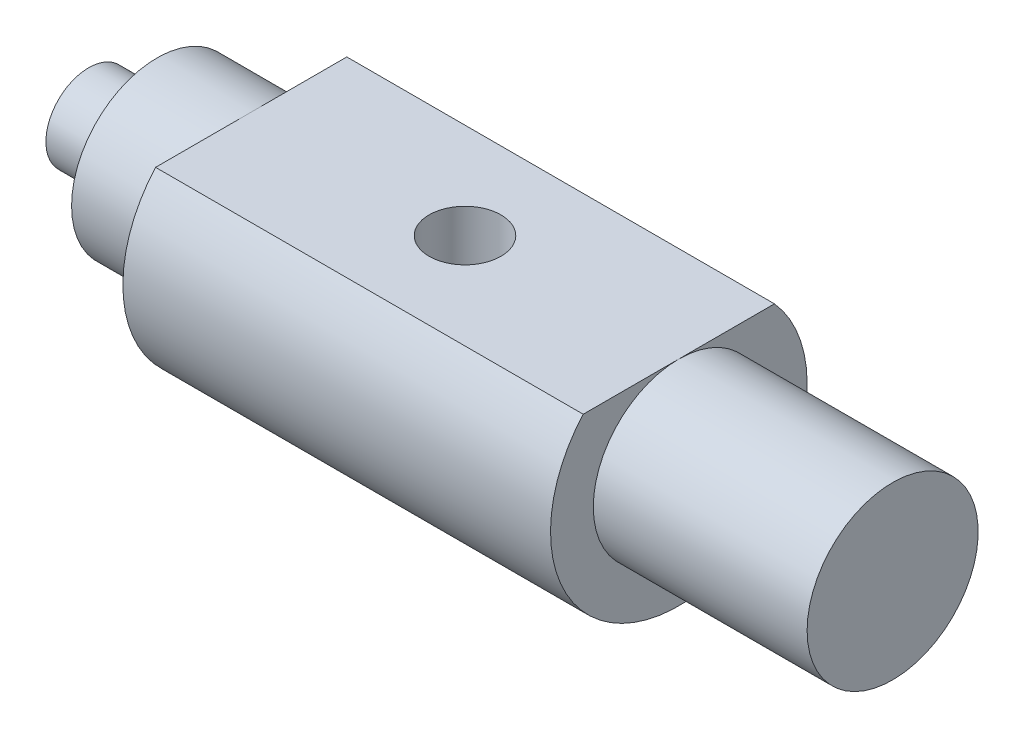
ISO-10303-21;
HEADER;
FILE_DESCRIPTION(('STEP AP214'),'2;1');
FILE_NAME('part.step','',(''),(''),'','','');
FILE_SCHEMA(('AUTOMOTIVE_DESIGN { 1 0 10303 214 1 1 1 1 }'));
ENDSEC;
DATA;
#1=APPLICATION_CONTEXT('core data for automotive mechanical design processes');
#2=APPLICATION_PROTOCOL_DEFINITION('international standard','automotive_design',2000,#1);
#3=PRODUCT_CONTEXT('',#1,'mechanical');
#4=PRODUCT('Part','Part','',(#3));
#5=PRODUCT_RELATED_PRODUCT_CATEGORY('part','',(#4));
#6=PRODUCT_DEFINITION_FORMATION('','',#4);
#7=PRODUCT_DEFINITION_CONTEXT('part definition',#1,'design');
#8=PRODUCT_DEFINITION('design','',#6,#7);
#9=PRODUCT_DEFINITION_SHAPE('','',#8);
#10=(LENGTH_UNIT() NAMED_UNIT(*) SI_UNIT(.MILLI.,.METRE.));
#11=(NAMED_UNIT(*) PLANE_ANGLE_UNIT() SI_UNIT($,.RADIAN.));
#12=(NAMED_UNIT(*) SI_UNIT($,.STERADIAN.) SOLID_ANGLE_UNIT());
#13=UNCERTAINTY_MEASURE_WITH_UNIT(LENGTH_MEASURE(1.E-05),#10,'distance_accuracy_value','');
#14=(GEOMETRIC_REPRESENTATION_CONTEXT(3) GLOBAL_UNCERTAINTY_ASSIGNED_CONTEXT((#13)) GLOBAL_UNIT_ASSIGNED_CONTEXT((#10,
#11,#12)) REPRESENTATION_CONTEXT('',''));
#15=CARTESIAN_POINT('',(0.,0.,0.));
#16=DIRECTION('',(0.,0.,1.));
#17=DIRECTION('',(1.,0.,0.));
#18=AXIS2_PLACEMENT_3D('',#15,#16,#17);
#19=CARTESIAN_POINT('',(-25.000012,0.,0.));
#20=DIRECTION('',(1.,0.,0.));
#21=DIRECTION('',(0.,0.,-1.));
#22=AXIS2_PLACEMENT_3D('',#19,#20,#21);
#23=CYLINDRICAL_SURFACE('',#22,2.5);
#24=CARTESIAN_POINT('',(-18.,0.,0.));
#25=DIRECTION('',(-1.,0.,0.));
#26=DIRECTION('',(0.,0.,1.));
#27=AXIS2_PLACEMENT_3D('',#24,#25,#26);
#28=CIRCLE('',#27,2.5);
#29=CARTESIAN_POINT('',(-18.,0.,-2.5));
#30=VERTEX_POINT('',#29);
#31=EDGE_CURVE('E94',#30,#30,#28,.T.);
#32=CARTESIAN_POINT('',(-22.,0.,0.));
#33=DIRECTION('',(-1.,0.,0.));
#34=DIRECTION('',(0.,0.,1.));
#35=AXIS2_PLACEMENT_3D('',#32,#33,#34);
#36=CIRCLE('',#35,2.5);
#37=CARTESIAN_POINT('',(-22.,0.,-2.5));
#38=VERTEX_POINT('',#37);
#39=EDGE_CURVE('E90',#38,#38,#36,.T.);
#40=CARTESIAN_POINT('',(-18.,0.,-2.5));
#41=CARTESIAN_POINT('',(-18.0416666666667,0.,-2.5));
#42=CARTESIAN_POINT('',(-18.0833333333333,0.,-2.5));
#43=CARTESIAN_POINT('',(-18.1666666666667,0.,-2.5));
#44=CARTESIAN_POINT('',(-18.2083333333333,0.,-2.5));
#45=CARTESIAN_POINT('',(-18.2916666666667,0.,-2.5));
#46=CARTESIAN_POINT('',(-18.3333333333333,0.,-2.5));
#47=CARTESIAN_POINT('',(-18.4166666666667,0.,-2.5));
#48=CARTESIAN_POINT('',(-18.4583333333333,0.,-2.5));
#49=CARTESIAN_POINT('',(-18.5416666666667,0.,-2.5));
#50=CARTESIAN_POINT('',(-18.5833333333333,0.,-2.5));
#51=CARTESIAN_POINT('',(-18.6666666666667,0.,-2.5));
#52=CARTESIAN_POINT('',(-18.7083333333333,0.,-2.5));
#53=CARTESIAN_POINT('',(-18.7916666666667,0.,-2.5));
#54=CARTESIAN_POINT('',(-18.8333333333333,0.,-2.5));
#55=CARTESIAN_POINT('',(-18.9166666666667,0.,-2.5));
#56=CARTESIAN_POINT('',(-18.9583333333333,0.,-2.5));
#57=CARTESIAN_POINT('',(-19.0416666666667,0.,-2.5));
#58=CARTESIAN_POINT('',(-19.0833333333333,0.,-2.5));
#59=CARTESIAN_POINT('',(-19.1666666666667,0.,-2.5));
#60=CARTESIAN_POINT('',(-19.2083333333333,0.,-2.5));
#61=CARTESIAN_POINT('',(-19.2916666666667,0.,-2.5));
#62=CARTESIAN_POINT('',(-19.3333333333333,0.,-2.5));
#63=CARTESIAN_POINT('',(-19.4166666666667,0.,-2.5));
#64=CARTESIAN_POINT('',(-19.4583333333333,0.,-2.5));
#65=CARTESIAN_POINT('',(-19.5416666666667,0.,-2.5));
#66=CARTESIAN_POINT('',(-19.5833333333333,0.,-2.5));
#67=CARTESIAN_POINT('',(-19.6666666666667,0.,-2.5));
#68=CARTESIAN_POINT('',(-19.7083333333333,0.,-2.5));
#69=CARTESIAN_POINT('',(-19.7916666666667,0.,-2.5));
#70=CARTESIAN_POINT('',(-19.8333333333333,0.,-2.5));
#71=CARTESIAN_POINT('',(-19.9166666666667,0.,-2.5));
#72=CARTESIAN_POINT('',(-19.9583333333333,0.,-2.5));
#73=CARTESIAN_POINT('',(-20.0416666666667,0.,-2.5));
#74=CARTESIAN_POINT('',(-20.0833333333333,0.,-2.5));
#75=CARTESIAN_POINT('',(-20.1666666666667,0.,-2.5));
#76=CARTESIAN_POINT('',(-20.2083333333333,0.,-2.5));
#77=CARTESIAN_POINT('',(-20.2916666666667,0.,-2.5));
#78=CARTESIAN_POINT('',(-20.3333333333333,0.,-2.5));
#79=CARTESIAN_POINT('',(-20.4166666666667,0.,-2.5));
#80=CARTESIAN_POINT('',(-20.4583333333333,0.,-2.5));
#81=CARTESIAN_POINT('',(-20.5416666666667,0.,-2.5));
#82=CARTESIAN_POINT('',(-20.5833333333333,0.,-2.5));
#83=CARTESIAN_POINT('',(-20.6666666666667,0.,-2.5));
#84=CARTESIAN_POINT('',(-20.7083333333333,0.,-2.5));
#85=CARTESIAN_POINT('',(-20.7916666666667,0.,-2.5));
#86=CARTESIAN_POINT('',(-20.8333333333333,0.,-2.5));
#87=CARTESIAN_POINT('',(-20.9166666666667,0.,-2.5));
#88=CARTESIAN_POINT('',(-20.9583333333333,0.,-2.5));
#89=CARTESIAN_POINT('',(-21.0416666666667,0.,-2.5));
#90=CARTESIAN_POINT('',(-21.0833333333333,0.,-2.5));
#91=CARTESIAN_POINT('',(-21.1666666666667,0.,-2.5));
#92=CARTESIAN_POINT('',(-21.2083333333333,0.,-2.5));
#93=CARTESIAN_POINT('',(-21.2916666666667,0.,-2.5));
#94=CARTESIAN_POINT('',(-21.3333333333333,0.,-2.5));
#95=CARTESIAN_POINT('',(-21.4166666666667,0.,-2.5));
#96=CARTESIAN_POINT('',(-21.4583333333333,0.,-2.5));
#97=CARTESIAN_POINT('',(-21.5416666666667,0.,-2.5));
#98=CARTESIAN_POINT('',(-21.5833333333333,0.,-2.5));
#99=CARTESIAN_POINT('',(-21.6666666666667,0.,-2.5));
#100=CARTESIAN_POINT('',(-21.7083333333333,0.,-2.5));
#101=CARTESIAN_POINT('',(-21.7916666666667,0.,-2.5));
#102=CARTESIAN_POINT('',(-21.8333333333333,0.,-2.5));
#103=CARTESIAN_POINT('',(-21.9166666666667,0.,-2.5));
#104=CARTESIAN_POINT('',(-21.9583333333333,0.,-2.5));
#105=CARTESIAN_POINT('',(-22.,0.,-2.5));
#106=B_SPLINE_CURVE_WITH_KNOTS('',3,(#40,#41,#42,#43,#44,#45,#46,#47,#48,#49,#50,#51,#52,#53,
#54,#55,#56,#57,#58,#59,#60,#61,#62,#63,#64,#65,#66,#67,#68,#69,#70,#71,#72,#73,#74,#75,#76,#77,
#78,#79,#80,#81,#82,#83,#84,#85,#86,#87,#88,#89,#90,#91,#92,#93,#94,#95,#96,#97,#98,#99,#100,
#101,#102,#103,#104,#105),.UNSPECIFIED.,.F.,.F.,(4,2,2,2,2,2,2,2,2,2,2,2,2,2,2,2,2,2,2,2,2,2,2,
2,2,2,2,2,2,2,2,2,4),(0.,0.125,0.25,0.375,0.5,0.625000000000001,0.750000000000001,
0.875000000000001,1.,1.125,1.25,1.375,1.5,1.625,1.75,1.875,2.,2.125,2.25,2.375,2.5,2.625,2.75,
2.875,3.,3.125,3.25,3.375,3.5,3.625,3.75,3.875,4.),.UNSPECIFIED.);
#107=EDGE_CURVE('BSEAM45',#30,#38,#106,.T.);
#108=ORIENTED_EDGE('',*,*,#31,.T.);
#109=ORIENTED_EDGE('',*,*,#39,.F.);
#110=ORIENTED_EDGE('',*,*,#107,.T.);
#111=ORIENTED_EDGE('',*,*,#107,.F.);
#112=EDGE_LOOP('',(#108,#110,#109,#111));
#113=FACE_BOUND('',#112,.T.);
#114=ADVANCED_FACE('F45',(#113),#23,.T.);
#115=CARTESIAN_POINT('',(0.,0.,0.));
#116=DIRECTION('',(1.,0.,0.));
#117=DIRECTION('',(0.,0.,1.));
#118=AXIS2_PLACEMENT_3D('',#115,#116,#117);
#119=CYLINDRICAL_SURFACE('',#118,5.);
#120=CARTESIAN_POINT('',(-12.5,0.,0.));
#121=DIRECTION('',(-1.,0.,0.));
#122=DIRECTION('',(0.,0.,1.));
#123=AXIS2_PLACEMENT_3D('',#120,#121,#122);
#124=CIRCLE('',#123,5.);
#125=CARTESIAN_POINT('',(-12.5,5.,0.));
#126=VERTEX_POINT('',#125);
#127=EDGE_CURVE('E242',#126,#126,#124,.T.);
#128=ORIENTED_EDGE('',*,*,#127,.T.);
#129=EDGE_LOOP('',(#128));
#130=FACE_BOUND('',#129,.T.);
#131=CARTESIAN_POINT('',(-18.,0.,0.));
#132=DIRECTION('',(-1.,0.,0.));
#133=DIRECTION('',(0.,0.,1.));
#134=AXIS2_PLACEMENT_3D('',#131,#132,#133);
#135=CIRCLE('',#134,5.);
#136=CARTESIAN_POINT('',(-18.,0.,5.));
#137=VERTEX_POINT('',#136);
#138=EDGE_CURVE('E49',#137,#137,#135,.T.);
#139=ORIENTED_EDGE('',*,*,#138,.F.);
#140=EDGE_LOOP('',(#139));
#141=FACE_BOUND('',#140,.T.);
#142=ADVANCED_FACE('F124',(#130,#141),#119,.T.);
#143=CARTESIAN_POINT('',(0.,0.,0.));
#144=DIRECTION('',(-1.,0.,0.));
#145=DIRECTION('',(0.,0.,1.));
#146=AXIS2_PLACEMENT_3D('',#143,#144,#145);
#147=CYLINDRICAL_SURFACE('',#146,7.5);
#148=CARTESIAN_POINT('',(0.,-7.2,2.09999999999999));
#149=CARTESIAN_POINT('',(0.115448894828676,-7.2000017509261,2.09999769142371));
#150=CARTESIAN_POINT('',(0.230921424679272,-7.20280713265303,2.090447258008));
#151=CARTESIAN_POINT('',(0.458515712449795,-7.21368770991474,2.05258019102824));
#152=CARTESIAN_POINT('',(0.570635988813941,-7.22176520052275,2.02425538445371));
#153=CARTESIAN_POINT('',(0.788199760116363,-7.24220502233452,1.94985652031882));
#154=CARTESIAN_POINT('',(0.893653023812849,-7.25456090412264,1.90380916683966));
#155=CARTESIAN_POINT('',(1.09535792393352,-7.28215690109494,1.79535769220004));
#156=CARTESIAN_POINT('',(1.19160858017576,-7.29739732300137,1.73295183131605));
#157=CARTESIAN_POINT('',(1.37482947583615,-7.32951618449187,1.59171413202466));
#158=CARTESIAN_POINT('',(1.46150844592224,-7.34642599336529,1.51251149606311));
#159=CARTESIAN_POINT('',(1.6205431520083,-7.3797086675302,1.34072490285875));
#160=CARTESIAN_POINT('',(1.69289727151185,-7.39608147204938,1.24813943745967));
#161=CARTESIAN_POINT('',(1.82246234837499,-7.42679785762244,1.0501753641818));
#162=CARTESIAN_POINT('',(1.87938086460981,-7.44110013563312,0.944598390212243));
#163=CARTESIAN_POINT('',(1.97454690823152,-7.46570231446394,0.724904746771351));
#164=CARTESIAN_POINT('',(2.01279792049924,-7.4760029622418,0.610789675797225));
#165=CARTESIAN_POINT('',(2.06859227525808,-7.49121941354851,0.380302236373026));
#166=CARTESIAN_POINT('',(2.08663176061564,-7.49626401123116,0.264058623362756));
#167=CARTESIAN_POINT('',(2.10305497873383,-7.50085154395725,0.0300927460088099));
#168=CARTESIAN_POINT('',(2.10144232524846,-7.50039549049382,-0.0876292425050772));
#169=CARTESIAN_POINT('',(2.07895011668026,-7.49412619131461,-0.317746311518629));
#170=CARTESIAN_POINT('',(2.05860706033313,-7.48846212582118,-0.43019852288703));
#171=CARTESIAN_POINT('',(2.00010196069196,-7.47259127690994,-0.650024177765253));
#172=CARTESIAN_POINT('',(1.96193885256542,-7.4623842220287,-0.75739731735417));
#173=CARTESIAN_POINT('',(1.86848460644453,-7.43835884069074,-0.965349801263518));
#174=CARTESIAN_POINT('',(1.81301555069456,-7.42450324668395,-1.06584470618674));
#175=CARTESIAN_POINT('',(1.68666204006246,-7.39466485562083,-1.25627862457918));
#176=CARTESIAN_POINT('',(1.61577431925669,-7.37868160817165,-1.34621539544035));
#177=CARTESIAN_POINT('',(1.45777245644652,-7.34567522057905,-1.51618305590153));
#178=CARTESIAN_POINT('',(1.37019141589659,-7.32863518998309,-1.59577717509012));
#179=CARTESIAN_POINT('',(1.18275131354796,-7.29591665217891,-1.73926156835204));
#180=CARTESIAN_POINT('',(1.08289133646101,-7.28023824661686,-1.80315067068665));
#181=CARTESIAN_POINT('',(0.872703330004007,-7.25194501002576,-1.91379030231589));
#182=CARTESIAN_POINT('',(0.762303294278444,-7.23935371206725,-1.96041048527215));
#183=CARTESIAN_POINT('',(0.534789447216039,-7.21894665875122,-2.03427979371573));
#184=CARTESIAN_POINT('',(0.417677509366761,-7.21112957780356,-2.06153429654469));
#185=CARTESIAN_POINT('',(0.184177346036703,-7.20144181427927,-2.09512133703559));
#186=CARTESIAN_POINT('',(0.0678911726799895,-7.19938465899453,-2.10211023295226));
#187=CARTESIAN_POINT('',(-0.16419067902114,-7.20093733719562,-2.09678562260948));
#188=CARTESIAN_POINT('',(-0.279986414098294,-7.20454649620961,-2.08447441367736));
#189=CARTESIAN_POINT('',(-0.505192111961204,-7.21684386770043,-2.04148011473316));
#190=CARTESIAN_POINT('',(-0.614686177437148,-7.22541993924817,-2.01120230768184));
#191=CARTESIAN_POINT('',(-0.827038759285992,-7.24657269498035,-1.9335954321454));
#192=CARTESIAN_POINT('',(-0.92989634292425,-7.2591499400491,-1.88626397295672));
#193=CARTESIAN_POINT('',(-1.12877269761775,-7.28726240690147,-1.77459509136293));
#194=CARTESIAN_POINT('',(-1.224569166007,-7.30286116048027,-1.70987813502038));
#195=CARTESIAN_POINT('',(-1.40418314643845,-7.33511474861878,-1.56573803326782));
#196=CARTESIAN_POINT('',(-1.48799816133002,-7.35176980228926,-1.48631183008104));
#197=CARTESIAN_POINT('',(-1.64405083657379,-7.38490975407121,-1.31195238316687));
#198=CARTESIAN_POINT('',(-1.71582776949723,-7.4013718288206,-1.21660153256646));
#199=CARTESIAN_POINT('',(-1.84236295569934,-7.43172364179825,-1.0148282251243));
#200=CARTESIAN_POINT('',(-1.89712210812569,-7.44561351591507,-0.908406353625249));
#201=CARTESIAN_POINT('',(-1.98754923511423,-7.46916678636433,-0.688255620931214));
#202=CARTESIAN_POINT('',(-2.0233615963978,-7.47886204186584,-0.57458964296995));
#203=CARTESIAN_POINT('',(-2.07528178854123,-7.4930742926061,-0.342537614831903));
#204=CARTESIAN_POINT('',(-2.09139447100867,-7.49759256280785,-0.224152734238766));
#205=CARTESIAN_POINT('',(-2.10312839471999,-7.50087475153957,0.00969112124072532));
#206=CARTESIAN_POINT('',(-2.09942230404542,-7.49982757425403,0.125114144971011));
#207=CARTESIAN_POINT('',(-2.07320361138513,-7.49253071356722,0.35362688103667));
#208=CARTESIAN_POINT('',(-2.05069184855538,-7.48628126230442,0.466716697254849));
#209=CARTESIAN_POINT('',(-1.9878961395834,-7.46932613881606,0.686456269375142));
#210=CARTESIAN_POINT('',(-1.94776095431701,-7.4586578085919,0.793151611784456));
#211=CARTESIAN_POINT('',(-1.85098998719994,-7.43397489084362,0.998353701041717));
#212=CARTESIAN_POINT('',(-1.79435171944604,-7.41995979924538,1.09685921135807));
#213=CARTESIAN_POINT('',(-1.66428300177141,-7.38956927564245,1.28596610763476));
#214=CARTESIAN_POINT('',(-1.59041564694984,-7.37313745973981,1.37625788128737));
#215=CARTESIAN_POINT('',(-1.42879782153953,-7.33997403900929,1.54339107601341));
#216=CARTESIAN_POINT('',(-1.34104357518202,-7.32324235374892,1.6202288270092));
#217=CARTESIAN_POINT('',(-1.15151287771814,-7.29088892650894,1.7601810081138));
#218=CARTESIAN_POINT('',(-1.04944137267978,-7.27530525828303,1.82290552428642));
#219=CARTESIAN_POINT('',(-0.835778008759381,-7.24757503896698,1.93021956053794));
#220=CARTESIAN_POINT('',(-0.724191806851347,-7.23542646383001,1.97481976673698));
#221=CARTESIAN_POINT('',(-0.511017150350903,-7.2174445712127,2.0394730088432));
#222=CARTESIAN_POINT('',(-0.410261761127128,-7.21095909202013,2.06211391312519));
#223=CARTESIAN_POINT('',(-0.206343642914264,-7.20223632826997,2.09237736458971));
#224=CARTESIAN_POINT('',(-0.103181260938115,-7.19999843512782,2.10000206326627));
#225=CARTESIAN_POINT('',(0.,-7.2,2.09999999999999));
#226=B_SPLINE_CURVE_WITH_KNOTS('',3,(#148,#149,#150,#151,#152,#153,#154,#155,#156,#157,#158,
#159,#160,#161,#162,#163,#164,#165,#166,#167,#168,#169,#170,#171,#172,#173,#174,#175,#176,#177,
#178,#179,#180,#181,#182,#183,#184,#185,#186,#187,#188,#189,#190,#191,#192,#193,#194,#195,#196,
#197,#198,#199,#200,#201,#202,#203,#204,#205,#206,#207,#208,#209,#210,#211,#212,#213,#214,#215,
#216,#217,#218,#219,#220,#221,#222,#223,#224,#225),.UNSPECIFIED.,.T.,.F.,(4,2,2,2,2,2,2,2,2,2,2,
2,2,2,2,2,2,2,2,2,2,2,2,2,2,2,2,2,2,2,2,2,2,2,2,2,2,2,4),(0.,0.345966820679475,
0.692084349409677,1.03768238213021,1.38331718404489,1.73757082880146,2.09186442676817,
2.45246381411617,2.81299585839308,3.1644693582517,3.5158782280151,3.85752460211592,
4.19919139381876,4.54449343533438,4.8898686887804,5.24690042870956,5.60395879841148,
5.96365984094945,6.32326096486548,6.67107770948493,7.01885305597462,7.35906666926099,
7.69932799470602,8.04772451120088,8.39619353426623,8.75590447674838,9.11559641039039,
9.47250627059269,9.8293282138483,10.1741178008123,10.5188920032276,10.8608102624592,
11.202780052397,11.5546053491271,11.9065264700836,12.267221716464,12.627703986753,
12.9369525819905,13.2461568654393),.UNSPECIFIED.);
#227=CARTESIAN_POINT('',(0.,-7.2,2.09999999999999));
#228=VERTEX_POINT('',#227);
#229=EDGE_CURVE('E104',#228,#228,#226,.T.);
#230=ORIENTED_EDGE('',*,*,#229,.T.);
#231=EDGE_LOOP('',(#230));
#232=FACE_BOUND('',#231,.T.);
#233=CARTESIAN_POINT('',(12.5,0.,0.));
#234=DIRECTION('',(-1.,0.,0.));
#235=DIRECTION('',(0.,0.,1.));
#236=AXIS2_PLACEMENT_3D('',#233,#234,#235);
#237=CIRCLE('',#236,7.5);
#238=CARTESIAN_POINT('',(12.5,5.,-5.59016994374947));
#239=VERTEX_POINT('',#238);
#240=CARTESIAN_POINT('',(12.5,5.,5.59016994374947));
#241=VERTEX_POINT('',#240);
#242=EDGE_CURVE('E12',#239,#241,#237,.T.);
#243=ORIENTED_EDGE('',*,*,#242,.T.);
#244=DIRECTION('',(-1.,0.,0.));
#245=VECTOR('',#244,1.);
#246=CARTESIAN_POINT('',(0.,5.,5.59016994374947));
#247=LINE('',#246,#245);
#248=CARTESIAN_POINT('',(-12.5,5.,5.59016994374947));
#249=VERTEX_POINT('',#248);
#250=EDGE_CURVE('E247',#241,#249,#247,.T.);
#251=ORIENTED_EDGE('',*,*,#250,.T.);
#252=CARTESIAN_POINT('',(-12.5,0.,0.));
#253=DIRECTION('',(-1.,0.,0.));
#254=DIRECTION('',(0.,0.,1.));
#255=AXIS2_PLACEMENT_3D('',#252,#253,#254);
#256=CIRCLE('',#255,7.5);
#257=CARTESIAN_POINT('',(-12.5,5.,-5.59016994374947));
#258=VERTEX_POINT('',#257);
#259=EDGE_CURVE('E237',#258,#249,#256,.T.);
#260=ORIENTED_EDGE('',*,*,#259,.F.);
#261=DIRECTION('',(-1.,0.,0.));
#262=VECTOR('',#261,1.);
#263=CARTESIAN_POINT('',(0.,5.,-5.59016994374947));
#264=LINE('',#263,#262);
#265=EDGE_CURVE('E61',#258,#239,#264,.F.);
#266=ORIENTED_EDGE('',*,*,#265,.T.);
#267=EDGE_LOOP('',(#243,#251,#260,#266));
#268=FACE_BOUND('',#267,.T.);
#269=ADVANCED_FACE('F47',(#232,#268),#147,.T.);
#270=CARTESIAN_POINT('',(12.5,7.5,0.));
#271=DIRECTION('',(-1.,0.,0.));
#272=DIRECTION('',(0.,0.,1.));
#273=AXIS2_PLACEMENT_3D('',#270,#271,#272);
#274=PLANE('',#273);
#275=ORIENTED_EDGE('',*,*,#242,.F.);
#276=DIRECTION('',(0.,0.,-1.));
#277=VECTOR('',#276,1.);
#278=CARTESIAN_POINT('',(12.5,5.,11.6111321451204));
#279=LINE('',#278,#277);
#280=CARTESIAN_POINT('',(12.5,5.,0.));
#281=VERTEX_POINT('',#280);
#282=EDGE_CURVE('E66',#281,#239,#279,.T.);
#283=ORIENTED_EDGE('',*,*,#282,.F.);
#284=CARTESIAN_POINT('',(12.5,0.,0.));
#285=DIRECTION('',(-1.,0.,0.));
#286=DIRECTION('',(0.,0.,1.));
#287=AXIS2_PLACEMENT_3D('',#284,#285,#286);
#288=CIRCLE('',#287,5.);
#289=EDGE_CURVE('E54',#281,#281,#288,.T.);
#290=ORIENTED_EDGE('',*,*,#289,.T.);
#291=EDGE_CURVE('E252',#241,#281,#279,.T.);
#292=ORIENTED_EDGE('',*,*,#291,.F.);
#293=EDGE_LOOP('',(#275,#283,#290,#292));
#294=FACE_BOUND('',#293,.T.);
#295=ADVANCED_FACE('F187',(#294),#274,.F.);
#296=CARTESIAN_POINT('',(0.,0.,0.));
#297=DIRECTION('',(-1.,0.,0.));
#298=DIRECTION('',(0.,0.,1.));
#299=AXIS2_PLACEMENT_3D('',#296,#297,#298);
#300=CYLINDRICAL_SURFACE('',#299,5.);
#301=ORIENTED_EDGE('',*,*,#289,.F.);
#302=EDGE_LOOP('',(#301));
#303=FACE_BOUND('',#302,.T.);
#304=CARTESIAN_POINT('',(25.,0.,0.));
#305=DIRECTION('',(-1.,0.,0.));
#306=DIRECTION('',(0.,0.,1.));
#307=AXIS2_PLACEMENT_3D('',#304,#305,#306);
#308=CIRCLE('',#307,5.);
#309=CARTESIAN_POINT('',(25.,0.,5.));
#310=VERTEX_POINT('',#309);
#311=EDGE_CURVE('E235',#310,#310,#308,.T.);
#312=ORIENTED_EDGE('',*,*,#311,.T.);
#313=EDGE_LOOP('',(#312));
#314=FACE_BOUND('',#313,.T.);
#315=ADVANCED_FACE('F201',(#303,#314),#300,.T.);
#316=CARTESIAN_POINT('',(25.,5.,0.));
#317=DIRECTION('',(-1.,0.,0.));
#318=DIRECTION('',(0.,0.,1.));
#319=AXIS2_PLACEMENT_3D('',#316,#317,#318);
#320=PLANE('',#319);
#321=ORIENTED_EDGE('',*,*,#311,.F.);
#322=EDGE_LOOP('',(#321));
#323=FACE_BOUND('',#322,.T.);
#324=ADVANCED_FACE('F195',(#323),#320,.F.);
#325=CARTESIAN_POINT('',(-12.5,7.5,0.));
#326=DIRECTION('',(1.,0.,0.));
#327=DIRECTION('',(0.,0.,1.));
#328=AXIS2_PLACEMENT_3D('',#325,#326,#327);
#329=PLANE('',#328);
#330=ORIENTED_EDGE('',*,*,#259,.T.);
#331=DIRECTION('',(0.,0.,1.));
#332=VECTOR('',#331,1.);
#333=CARTESIAN_POINT('',(-12.5,5.,11.6111321451204));
#334=LINE('',#333,#332);
#335=EDGE_CURVE('E251',#126,#249,#334,.T.);
#336=ORIENTED_EDGE('',*,*,#335,.F.);
#337=ORIENTED_EDGE('',*,*,#127,.F.);
#338=EDGE_CURVE('E250',#258,#126,#334,.T.);
#339=ORIENTED_EDGE('',*,*,#338,.F.);
#340=EDGE_LOOP('',(#330,#336,#337,#339));
#341=FACE_BOUND('',#340,.T.);
#342=ADVANCED_FACE('F178',(#341),#329,.F.);
#343=CARTESIAN_POINT('',(0.,5.,0.));
#344=DIRECTION('',(0.,-1.,0.));
#345=DIRECTION('',(0.,0.,-1.));
#346=AXIS2_PLACEMENT_3D('',#343,#344,#345);
#347=PLANE('',#346);
#348=CARTESIAN_POINT('',(0.,5.,0.));
#349=DIRECTION('',(0.,1.,0.));
#350=DIRECTION('',(0.,0.,1.));
#351=AXIS2_PLACEMENT_3D('',#348,#349,#350);
#352=CIRCLE('',#351,2.09999999999999);
#353=CARTESIAN_POINT('',(0.,5.,2.09999999999999));
#354=VERTEX_POINT('',#353);
#355=EDGE_CURVE('E101',#354,#354,#352,.T.);
#356=ORIENTED_EDGE('',*,*,#355,.F.);
#357=EDGE_LOOP('',(#356));
#358=FACE_BOUND('',#357,.T.);
#359=ORIENTED_EDGE('',*,*,#291,.T.);
#360=ORIENTED_EDGE('',*,*,#282,.T.);
#361=ORIENTED_EDGE('',*,*,#265,.F.);
#362=ORIENTED_EDGE('',*,*,#338,.T.);
#363=ORIENTED_EDGE('',*,*,#335,.T.);
#364=ORIENTED_EDGE('',*,*,#250,.F.);
#365=EDGE_LOOP('',(#359,#360,#361,#362,#363,#364));
#366=FACE_BOUND('',#365,.T.);
#367=ADVANCED_FACE('F120',(#358,#366),#347,.F.);
#368=CARTESIAN_POINT('',(0.,5.,0.));
#369=DIRECTION('',(0.,1.,0.));
#370=DIRECTION('',(0.,0.,1.));
#371=AXIS2_PLACEMENT_3D('',#368,#369,#370);
#372=CYLINDRICAL_SURFACE('',#371,2.09999999999999);
#373=ORIENTED_EDGE('',*,*,#229,.F.);
#374=EDGE_LOOP('',(#373));
#375=FACE_BOUND('',#374,.T.);
#376=ORIENTED_EDGE('',*,*,#355,.T.);
#377=EDGE_LOOP('',(#376));
#378=FACE_BOUND('',#377,.T.);
#379=ADVANCED_FACE('F115',(#375,#378),#372,.F.);
#380=CARTESIAN_POINT('',(-18.,-1.25,0.));
#381=DIRECTION('',(-1.,0.,0.));
#382=DIRECTION('',(0.,0.,1.));
#383=AXIS2_PLACEMENT_3D('',#380,#381,#382);
#384=PLANE('',#383);
#385=ORIENTED_EDGE('',*,*,#31,.F.);
#386=EDGE_LOOP('',(#385));
#387=FACE_BOUND('',#386,.T.);
#388=ORIENTED_EDGE('',*,*,#138,.T.);
#389=EDGE_LOOP('',(#388));
#390=FACE_BOUND('',#389,.T.);
#391=ADVANCED_FACE('F119',(#387,#390),#384,.T.);
#392=CARTESIAN_POINT('',(-22.,0.,0.));
#393=DIRECTION('',(-1.,0.,0.));
#394=DIRECTION('',(0.,0.,1.));
#395=AXIS2_PLACEMENT_3D('',#392,#393,#394);
#396=PLANE('',#395);
#397=CARTESIAN_POINT('',(-22.,3.24360763942488E-12,6.64399091299117E-13));
#398=DIRECTION('',(-1.,0.,0.));
#399=DIRECTION('',(0.,0.,1.));
#400=AXIS2_PLACEMENT_3D('',#397,#398,#399);
#401=CIRCLE('',#400,1.64999999999999);
#402=CARTESIAN_POINT('',(-22.,3.24360763942488E-12,1.65000000000065));
#403=VERTEX_POINT('',#402);
#404=EDGE_CURVE('E91',#403,#403,#401,.T.);
#405=ORIENTED_EDGE('',*,*,#404,.F.);
#406=EDGE_LOOP('',(#405));
#407=FACE_BOUND('',#406,.T.);
#408=ORIENTED_EDGE('',*,*,#39,.T.);
#409=EDGE_LOOP('',(#408));
#410=FACE_BOUND('',#409,.T.);
#411=ADVANCED_FACE('F84',(#407,#410),#396,.T.);
#412=CARTESIAN_POINT('',(-14.,3.24360763942488E-12,6.64399091299117E-13));
#413=DIRECTION('',(-1.,0.,0.));
#414=DIRECTION('',(0.,0.,1.));
#415=AXIS2_PLACEMENT_3D('',#412,#413,#414);
#416=CONICAL_SURFACE('',#415,1.65,1.02974425867665);
#417=CARTESIAN_POINT('',(-13.0085799786045,3.24140537667509E-12,6.64399091299117E-13));
#418=VERTEX_POINT('',#417);
#419=VERTEX_LOOP('',#418);
#420=FACE_BOUND('',#419,.T.);
#421=CARTESIAN_POINT('',(-14.,3.24360763942488E-12,6.64399091299117E-13));
#422=DIRECTION('',(-1.,0.,0.));
#423=DIRECTION('',(0.,0.,1.));
#424=AXIS2_PLACEMENT_3D('',#421,#422,#423);
#425=CIRCLE('',#424,1.65);
#426=CARTESIAN_POINT('',(-14.,3.24360763942488E-12,1.65000000000066));
#427=VERTEX_POINT('',#426);
#428=EDGE_CURVE('E88',#427,#427,#425,.T.);
#429=ORIENTED_EDGE('',*,*,#428,.T.);
#430=EDGE_LOOP('',(#429));
#431=FACE_BOUND('',#430,.T.);
#432=ADVANCED_FACE('F80',(#420,#431),#416,.F.);
#433=CARTESIAN_POINT('',(-22.,3.24360763942488E-12,6.64399091299117E-13));
#434=DIRECTION('',(-1.,0.,0.));
#435=DIRECTION('',(0.,0.,1.));
#436=AXIS2_PLACEMENT_3D('',#433,#434,#435);
#437=CYLINDRICAL_SURFACE('',#436,1.64999999999999);
#438=ORIENTED_EDGE('',*,*,#428,.F.);
#439=EDGE_LOOP('',(#438));
#440=FACE_BOUND('',#439,.T.);
#441=ORIENTED_EDGE('',*,*,#404,.T.);
#442=EDGE_LOOP('',(#441));
#443=FACE_BOUND('',#442,.T.);
#444=ADVANCED_FACE('F83',(#440,#443),#437,.F.);
#445=CLOSED_SHELL('',(#114,#142,#269,#295,#315,#324,#342,#367,#379,#391,#411,#432,#444));
#446=MANIFOLD_SOLID_BREP('B2',#445);
#447=ADVANCED_BREP_SHAPE_REPRESENTATION('',(#18,#446),#14);
#448=SHAPE_DEFINITION_REPRESENTATION(#9,#447);
ENDSEC;
END-ISO-10303-21;
